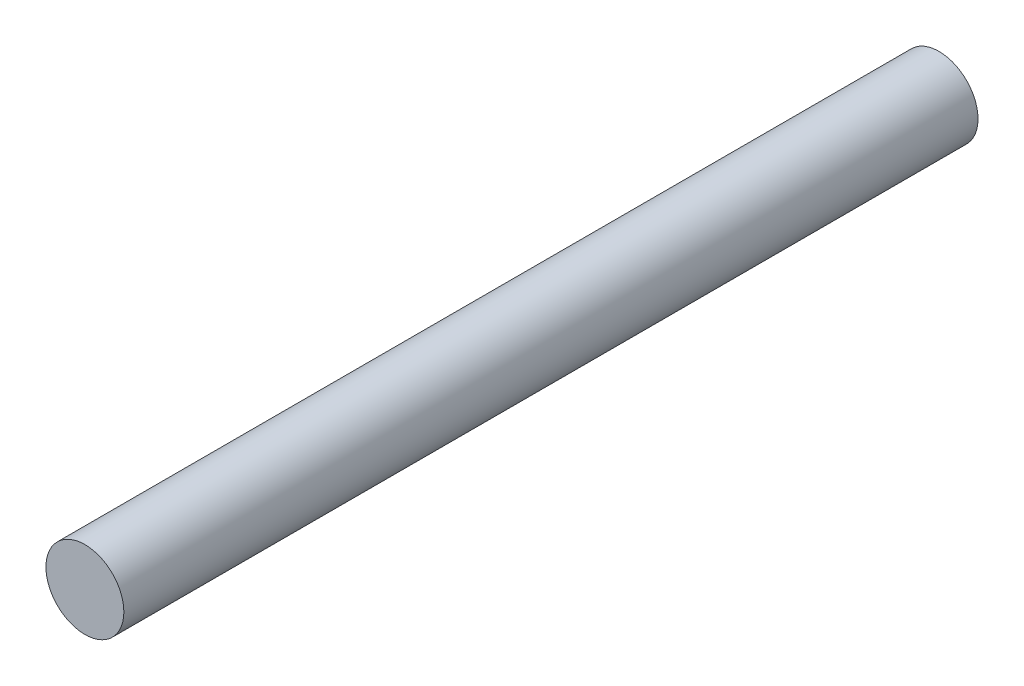
ISO-10303-21;
HEADER;
FILE_DESCRIPTION(('STEP AP214'),'2;1');
FILE_NAME('part.step','',(''),(''),'','','');
FILE_SCHEMA(('AUTOMOTIVE_DESIGN { 1 0 10303 214 1 1 1 1 }'));
ENDSEC;
DATA;
#1=APPLICATION_CONTEXT('core data for automotive mechanical design processes');
#2=APPLICATION_PROTOCOL_DEFINITION('international standard','automotive_design',2000,#1);
#3=PRODUCT_CONTEXT('',#1,'mechanical');
#4=PRODUCT('Part','Part','',(#3));
#5=PRODUCT_RELATED_PRODUCT_CATEGORY('part','',(#4));
#6=PRODUCT_DEFINITION_FORMATION('','',#4);
#7=PRODUCT_DEFINITION_CONTEXT('part definition',#1,'design');
#8=PRODUCT_DEFINITION('design','',#6,#7);
#9=PRODUCT_DEFINITION_SHAPE('','',#8);
#10=(LENGTH_UNIT() NAMED_UNIT(*) SI_UNIT(.MILLI.,.METRE.));
#11=(NAMED_UNIT(*) PLANE_ANGLE_UNIT() SI_UNIT($,.RADIAN.));
#12=(NAMED_UNIT(*) SI_UNIT($,.STERADIAN.) SOLID_ANGLE_UNIT());
#13=UNCERTAINTY_MEASURE_WITH_UNIT(LENGTH_MEASURE(1.E-05),#10,'distance_accuracy_value','');
#14=(GEOMETRIC_REPRESENTATION_CONTEXT(3) GLOBAL_UNCERTAINTY_ASSIGNED_CONTEXT((#13)) GLOBAL_UNIT_ASSIGNED_CONTEXT((#10,
#11,#12)) REPRESENTATION_CONTEXT('',''));
#15=CARTESIAN_POINT('',(0.,0.,0.));
#16=DIRECTION('',(0.,0.,1.));
#17=DIRECTION('',(1.,0.,0.));
#18=AXIS2_PLACEMENT_3D('',#15,#16,#17);
#19=CARTESIAN_POINT('',(0.,0.,-139.192));
#20=DIRECTION('',(0.,0.,1.));
#21=DIRECTION('',(1.,0.,0.));
#22=AXIS2_PLACEMENT_3D('',#19,#20,#21);
#23=CYLINDRICAL_SURFACE('',#22,6.35);
#24=CARTESIAN_POINT('',(0.,0.,-139.192));
#25=DIRECTION('',(0.,0.,1.));
#26=DIRECTION('',(1.,0.,0.));
#27=AXIS2_PLACEMENT_3D('',#24,#25,#26);
#28=CIRCLE('',#27,6.35);
#29=CARTESIAN_POINT('',(6.35,0.,-139.192));
#30=VERTEX_POINT('',#29);
#31=EDGE_CURVE('E10',#30,#30,#28,.T.);
#32=ORIENTED_EDGE('',*,*,#31,.T.);
#33=EDGE_LOOP('',(#32));
#34=FACE_BOUND('',#33,.T.);
#35=CARTESIAN_POINT('',(0.,0.,0.));
#36=DIRECTION('',(0.,0.,1.));
#37=DIRECTION('',(1.,0.,0.));
#38=AXIS2_PLACEMENT_3D('',#35,#36,#37);
#39=CIRCLE('',#38,6.35);
#40=CARTESIAN_POINT('',(6.35,0.,0.));
#41=VERTEX_POINT('',#40);
#42=EDGE_CURVE('E40',#41,#41,#39,.T.);
#43=ORIENTED_EDGE('',*,*,#42,.F.);
#44=EDGE_LOOP('',(#43));
#45=FACE_BOUND('',#44,.T.);
#46=ADVANCED_FACE('F37',(#34,#45),#23,.T.);
#47=CARTESIAN_POINT('',(0.,0.,-139.192));
#48=DIRECTION('',(0.,0.,1.));
#49=DIRECTION('',(1.,0.,0.));
#50=AXIS2_PLACEMENT_3D('',#47,#48,#49);
#51=PLANE('',#50);
#52=ORIENTED_EDGE('',*,*,#31,.F.);
#53=EDGE_LOOP('',(#52));
#54=FACE_BOUND('',#53,.T.);
#55=ADVANCED_FACE('F52',(#54),#51,.F.);
#56=CARTESIAN_POINT('',(0.,0.,0.));
#57=DIRECTION('',(0.,0.,1.));
#58=DIRECTION('',(1.,0.,0.));
#59=AXIS2_PLACEMENT_3D('',#56,#57,#58);
#60=PLANE('',#59);
#61=ORIENTED_EDGE('',*,*,#42,.T.);
#62=EDGE_LOOP('',(#61));
#63=FACE_BOUND('',#62,.T.);
#64=ADVANCED_FACE('F49',(#63),#60,.T.);
#65=CLOSED_SHELL('',(#46,#55,#64));
#66=MANIFOLD_SOLID_BREP('B2',#65);
#67=ADVANCED_BREP_SHAPE_REPRESENTATION('',(#18,#66),#14);
#68=SHAPE_DEFINITION_REPRESENTATION(#9,#67);
ENDSEC;
END-ISO-10303-21;
